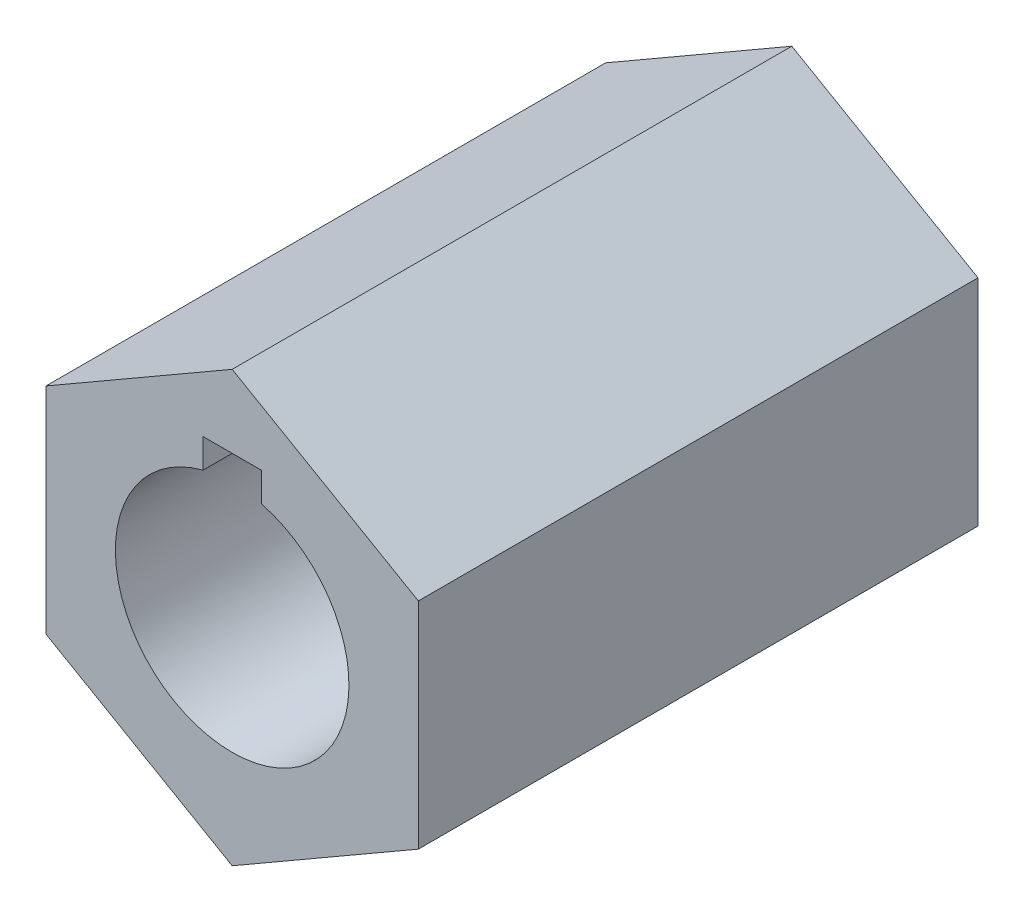
ISO-10303-21;
HEADER;
FILE_DESCRIPTION(('STEP AP214'),'2;1');
FILE_NAME('part.step','',(''),(''),'','','');
FILE_SCHEMA(('AUTOMOTIVE_DESIGN { 1 0 10303 214 1 1 1 1 }'));
ENDSEC;
DATA;
#1=APPLICATION_CONTEXT('core data for automotive mechanical design processes');
#2=APPLICATION_PROTOCOL_DEFINITION('international standard','automotive_design',2000,#1);
#3=PRODUCT_CONTEXT('',#1,'mechanical');
#4=PRODUCT('Part','Part','',(#3));
#5=PRODUCT_RELATED_PRODUCT_CATEGORY('part','',(#4));
#6=PRODUCT_DEFINITION_FORMATION('','',#4);
#7=PRODUCT_DEFINITION_CONTEXT('part definition',#1,'design');
#8=PRODUCT_DEFINITION('design','',#6,#7);
#9=PRODUCT_DEFINITION_SHAPE('','',#8);
#10=(LENGTH_UNIT() NAMED_UNIT(*) SI_UNIT(.MILLI.,.METRE.));
#11=(NAMED_UNIT(*) PLANE_ANGLE_UNIT() SI_UNIT($,.RADIAN.));
#12=(NAMED_UNIT(*) SI_UNIT($,.STERADIAN.) SOLID_ANGLE_UNIT());
#13=UNCERTAINTY_MEASURE_WITH_UNIT(LENGTH_MEASURE(1.E-05),#10,'distance_accuracy_value','');
#14=(GEOMETRIC_REPRESENTATION_CONTEXT(3) GLOBAL_UNCERTAINTY_ASSIGNED_CONTEXT((#13)) GLOBAL_UNIT_ASSIGNED_CONTEXT((#10,
#11,#12)) REPRESENTATION_CONTEXT('',''));
#15=CARTESIAN_POINT('',(0.,0.,0.));
#16=DIRECTION('',(0.,0.,1.));
#17=DIRECTION('',(1.,0.,0.));
#18=AXIS2_PLACEMENT_3D('',#15,#16,#17);
#19=CARTESIAN_POINT('',(6.33729999999998,0.,19.05));
#20=DIRECTION('',(-1.,0.,0.));
#21=DIRECTION('',(0.,-1.,0.));
#22=AXIS2_PLACEMENT_3D('',#19,#20,#21);
#23=PLANE('',#22);
#24=DIRECTION('',(0.,1.,0.));
#25=VECTOR('',#24,1.);
#26=CARTESIAN_POINT('',(6.33729999999998,0.,0.));
#27=LINE('',#26,#25);
#28=CARTESIAN_POINT('',(6.33729999999999,-3.65884186093543,0.));
#29=VERTEX_POINT('',#28);
#30=CARTESIAN_POINT('',(6.33729999999998,3.65884186093542,0.));
#31=VERTEX_POINT('',#30);
#32=EDGE_CURVE('E164',#29,#31,#27,.T.);
#33=ORIENTED_EDGE('',*,*,#32,.T.);
#34=DIRECTION('',(0.,0.,-1.));
#35=VECTOR('',#34,1.);
#36=CARTESIAN_POINT('',(6.33729999999998,3.65884186093542,19.05));
#37=LINE('',#36,#35);
#38=CARTESIAN_POINT('',(6.33729999999998,3.65884186093542,19.05));
#39=VERTEX_POINT('',#38);
#40=EDGE_CURVE('E11',#39,#31,#37,.T.);
#41=ORIENTED_EDGE('',*,*,#40,.F.);
#42=DIRECTION('',(0.,1.,0.));
#43=VECTOR('',#42,1.);
#44=CARTESIAN_POINT('',(6.33729999999998,0.,19.05));
#45=LINE('',#44,#43);
#46=CARTESIAN_POINT('',(6.33729999999999,-3.65884186093543,19.05));
#47=VERTEX_POINT('',#46);
#48=EDGE_CURVE('E245',#47,#39,#45,.T.);
#49=ORIENTED_EDGE('',*,*,#48,.F.);
#50=DIRECTION('',(0.,0.,-1.));
#51=VECTOR('',#50,1.);
#52=CARTESIAN_POINT('',(6.33729999999999,-3.65884186093543,19.05));
#53=LINE('',#52,#51);
#54=EDGE_CURVE('E175',#47,#29,#53,.T.);
#55=ORIENTED_EDGE('',*,*,#54,.T.);
#56=EDGE_LOOP('',(#33,#41,#49,#55));
#57=FACE_BOUND('',#56,.T.);
#58=ADVANCED_FACE('F39',(#57),#23,.F.);
#59=CARTESIAN_POINT('',(3.16865,5.48826279140312,19.05));
#60=DIRECTION('',(-0.5,-0.866025403784439,0.));
#61=DIRECTION('',(0.866025403784439,-0.5,0.));
#62=AXIS2_PLACEMENT_3D('',#59,#60,#61);
#63=PLANE('',#62);
#64=DIRECTION('',(-0.866025403784439,0.5,0.));
#65=VECTOR('',#64,1.);
#66=CARTESIAN_POINT('',(3.16865,5.48826279140312,0.));
#67=LINE('',#66,#65);
#68=CARTESIAN_POINT('',(0.,7.31768372187083,0.));
#69=VERTEX_POINT('',#68);
#70=EDGE_CURVE('E167',#31,#69,#67,.T.);
#71=ORIENTED_EDGE('',*,*,#70,.T.);
#72=DIRECTION('',(0.,0.,-1.));
#73=VECTOR('',#72,1.);
#74=CARTESIAN_POINT('',(0.,7.31768372187083,19.05));
#75=LINE('',#74,#73);
#76=CARTESIAN_POINT('',(0.,7.31768372187083,19.05));
#77=VERTEX_POINT('',#76);
#78=EDGE_CURVE('E49',#77,#69,#75,.T.);
#79=ORIENTED_EDGE('',*,*,#78,.F.);
#80=DIRECTION('',(-0.866025403784439,0.5,0.));
#81=VECTOR('',#80,1.);
#82=CARTESIAN_POINT('',(3.16865,5.48826279140312,19.05));
#83=LINE('',#82,#81);
#84=EDGE_CURVE('E247',#39,#77,#83,.T.);
#85=ORIENTED_EDGE('',*,*,#84,.F.);
#86=ORIENTED_EDGE('',*,*,#40,.T.);
#87=EDGE_LOOP('',(#71,#79,#85,#86));
#88=FACE_BOUND('',#87,.T.);
#89=ADVANCED_FACE('F214',(#88),#63,.F.);
#90=CARTESIAN_POINT('',(-3.16865,5.48826279140313,19.05));
#91=DIRECTION('',(0.5,-0.866025403784439,0.));
#92=DIRECTION('',(0.866025403784439,0.5,0.));
#93=AXIS2_PLACEMENT_3D('',#90,#91,#92);
#94=PLANE('',#93);
#95=DIRECTION('',(-0.866025403784439,-0.5,0.));
#96=VECTOR('',#95,1.);
#97=CARTESIAN_POINT('',(-3.16865,5.48826279140313,0.));
#98=LINE('',#97,#96);
#99=CARTESIAN_POINT('',(-6.3373,3.65884186093542,0.));
#100=VERTEX_POINT('',#99);
#101=EDGE_CURVE('E169',#69,#100,#98,.T.);
#102=ORIENTED_EDGE('',*,*,#101,.T.);
#103=DIRECTION('',(0.,0.,-1.));
#104=VECTOR('',#103,1.);
#105=CARTESIAN_POINT('',(-6.3373,3.65884186093542,19.05));
#106=LINE('',#105,#104);
#107=CARTESIAN_POINT('',(-6.3373,3.65884186093542,19.05));
#108=VERTEX_POINT('',#107);
#109=EDGE_CURVE('E142',#108,#100,#106,.T.);
#110=ORIENTED_EDGE('',*,*,#109,.F.);
#111=DIRECTION('',(-0.866025403784439,-0.5,0.));
#112=VECTOR('',#111,1.);
#113=CARTESIAN_POINT('',(-3.16865,5.48826279140313,19.05));
#114=LINE('',#113,#112);
#115=EDGE_CURVE('E133',#77,#108,#114,.T.);
#116=ORIENTED_EDGE('',*,*,#115,.F.);
#117=ORIENTED_EDGE('',*,*,#78,.T.);
#118=EDGE_LOOP('',(#102,#110,#116,#117));
#119=FACE_BOUND('',#118,.T.);
#120=ADVANCED_FACE('F220',(#119),#94,.F.);
#121=CARTESIAN_POINT('',(-6.3373,0.,19.05));
#122=DIRECTION('',(1.,0.,0.));
#123=DIRECTION('',(0.,0.,-1.));
#124=AXIS2_PLACEMENT_3D('',#121,#122,#123);
#125=PLANE('',#124);
#126=DIRECTION('',(0.,-1.,0.));
#127=VECTOR('',#126,1.);
#128=CARTESIAN_POINT('',(-6.3373,0.,0.));
#129=LINE('',#128,#127);
#130=CARTESIAN_POINT('',(-6.3373,-3.65884186093541,0.));
#131=VERTEX_POINT('',#130);
#132=EDGE_CURVE('E141',#100,#131,#129,.T.);
#133=ORIENTED_EDGE('',*,*,#132,.T.);
#134=DIRECTION('',(0.,0.,-1.));
#135=VECTOR('',#134,1.);
#136=CARTESIAN_POINT('',(-6.3373,-3.65884186093541,19.05));
#137=LINE('',#136,#135);
#138=CARTESIAN_POINT('',(-6.3373,-3.65884186093541,19.05));
#139=VERTEX_POINT('',#138);
#140=EDGE_CURVE('E138',#139,#131,#137,.T.);
#141=ORIENTED_EDGE('',*,*,#140,.F.);
#142=DIRECTION('',(0.,-1.,0.));
#143=VECTOR('',#142,1.);
#144=CARTESIAN_POINT('',(-6.3373,0.,19.05));
#145=LINE('',#144,#143);
#146=EDGE_CURVE('E127',#108,#139,#145,.T.);
#147=ORIENTED_EDGE('',*,*,#146,.F.);
#148=ORIENTED_EDGE('',*,*,#109,.T.);
#149=EDGE_LOOP('',(#133,#141,#147,#148));
#150=FACE_BOUND('',#149,.T.);
#151=ADVANCED_FACE('F139',(#150),#125,.F.);
#152=CARTESIAN_POINT('',(-3.16865,-5.48826279140312,19.05));
#153=DIRECTION('',(0.499999999999999,0.866025403784439,0.));
#154=DIRECTION('',(-0.866025403784439,0.5,0.));
#155=AXIS2_PLACEMENT_3D('',#152,#153,#154);
#156=PLANE('',#155);
#157=DIRECTION('',(0.866025403784439,-0.5,0.));
#158=VECTOR('',#157,1.);
#159=CARTESIAN_POINT('',(-3.16865,-5.48826279140312,0.));
#160=LINE('',#159,#158);
#161=CARTESIAN_POINT('',(0.,-7.31768372187083,0.));
#162=VERTEX_POINT('',#161);
#163=EDGE_CURVE('E93',#131,#162,#160,.T.);
#164=ORIENTED_EDGE('',*,*,#163,.T.);
#165=DIRECTION('',(0.,0.,-1.));
#166=VECTOR('',#165,1.);
#167=CARTESIAN_POINT('',(0.,-7.31768372187083,19.05));
#168=LINE('',#167,#166);
#169=CARTESIAN_POINT('',(0.,-7.31768372187083,19.05));
#170=VERTEX_POINT('',#169);
#171=EDGE_CURVE('E143',#170,#162,#168,.T.);
#172=ORIENTED_EDGE('',*,*,#171,.F.);
#173=DIRECTION('',(0.866025403784439,-0.5,0.));
#174=VECTOR('',#173,1.);
#175=CARTESIAN_POINT('',(-3.16865,-5.48826279140312,19.05));
#176=LINE('',#175,#174);
#177=EDGE_CURVE('E131',#139,#170,#176,.T.);
#178=ORIENTED_EDGE('',*,*,#177,.F.);
#179=ORIENTED_EDGE('',*,*,#140,.T.);
#180=EDGE_LOOP('',(#164,#172,#178,#179));
#181=FACE_BOUND('',#180,.T.);
#182=ADVANCED_FACE('F145',(#181),#156,.F.);
#183=CARTESIAN_POINT('',(0.,0.,19.05));
#184=DIRECTION('',(0.,0.,-1.));
#185=DIRECTION('',(-1.,0.,0.));
#186=AXIS2_PLACEMENT_3D('',#183,#184,#185);
#187=CYLINDRICAL_SURFACE('',#186,3.9751);
#188=CARTESIAN_POINT('',(0.,0.,0.));
#189=DIRECTION('',(0.,0.,1.));
#190=DIRECTION('',(1.,0.,0.));
#191=AXIS2_PLACEMENT_3D('',#188,#189,#190);
#192=CIRCLE('',#191,3.9751);
#193=CARTESIAN_POINT('',(-0.9906,3.84969240979068,0.));
#194=VERTEX_POINT('',#193);
#195=CARTESIAN_POINT('',(0.9906,3.84969240979068,0.));
#196=VERTEX_POINT('',#195);
#197=EDGE_CURVE('E151',#194,#196,#192,.T.);
#198=ORIENTED_EDGE('',*,*,#197,.F.);
#199=DIRECTION('',(0.,0.,-1.));
#200=VECTOR('',#199,1.);
#201=CARTESIAN_POINT('',(-0.9906,3.84969240979068,19.05));
#202=LINE('',#201,#200);
#203=CARTESIAN_POINT('',(-0.9906,3.84969240979068,19.05));
#204=VERTEX_POINT('',#203);
#205=EDGE_CURVE('E43',#204,#194,#202,.T.);
#206=ORIENTED_EDGE('',*,*,#205,.F.);
#207=CARTESIAN_POINT('',(0.,0.,19.05));
#208=DIRECTION('',(0.,0.,1.));
#209=DIRECTION('',(1.,0.,0.));
#210=AXIS2_PLACEMENT_3D('',#207,#208,#209);
#211=CIRCLE('',#210,3.9751);
#212=CARTESIAN_POINT('',(0.9906,3.84969240979068,19.05));
#213=VERTEX_POINT('',#212);
#214=EDGE_CURVE('E174',#204,#213,#211,.T.);
#215=ORIENTED_EDGE('',*,*,#214,.T.);
#216=DIRECTION('',(0.,0.,-1.));
#217=VECTOR('',#216,1.);
#218=CARTESIAN_POINT('',(0.9906,3.84969240979068,19.05));
#219=LINE('',#218,#217);
#220=EDGE_CURVE('E147',#213,#196,#219,.T.);
#221=ORIENTED_EDGE('',*,*,#220,.T.);
#222=EDGE_LOOP('',(#198,#206,#215,#221));
#223=FACE_BOUND('',#222,.T.);
#224=ADVANCED_FACE('F41',(#223),#187,.F.);
#225=CARTESIAN_POINT('',(-0.9906,0.,19.05));
#226=DIRECTION('',(-1.,0.,0.));
#227=DIRECTION('',(0.,0.,1.));
#228=AXIS2_PLACEMENT_3D('',#225,#226,#227);
#229=PLANE('',#228);
#230=DIRECTION('',(0.,1.,0.));
#231=VECTOR('',#230,1.);
#232=CARTESIAN_POINT('',(-0.9906,0.,0.));
#233=LINE('',#232,#231);
#234=CARTESIAN_POINT('',(-0.9906,4.84029240979068,0.));
#235=VERTEX_POINT('',#234);
#236=EDGE_CURVE('E155',#194,#235,#233,.T.);
#237=ORIENTED_EDGE('',*,*,#236,.T.);
#238=DIRECTION('',(0.,0.,-1.));
#239=VECTOR('',#238,1.);
#240=CARTESIAN_POINT('',(-0.9906,4.84029240979068,19.05));
#241=LINE('',#240,#239);
#242=CARTESIAN_POINT('',(-0.9906,4.84029240979068,19.05));
#243=VERTEX_POINT('',#242);
#244=EDGE_CURVE('E183',#243,#235,#241,.T.);
#245=ORIENTED_EDGE('',*,*,#244,.F.);
#246=DIRECTION('',(0.,1.,0.));
#247=VECTOR('',#246,1.);
#248=CARTESIAN_POINT('',(-0.9906,0.,19.05));
#249=LINE('',#248,#247);
#250=EDGE_CURVE('E192',#204,#243,#249,.T.);
#251=ORIENTED_EDGE('',*,*,#250,.F.);
#252=ORIENTED_EDGE('',*,*,#205,.T.);
#253=EDGE_LOOP('',(#237,#245,#251,#252));
#254=FACE_BOUND('',#253,.T.);
#255=ADVANCED_FACE('F191',(#254),#229,.F.);
#256=CARTESIAN_POINT('',(0.,4.84029240979068,19.05));
#257=DIRECTION('',(0.,1.,0.));
#258=DIRECTION('',(-1.,0.,0.));
#259=AXIS2_PLACEMENT_3D('',#256,#257,#258);
#260=PLANE('',#259);
#261=DIRECTION('',(1.,0.,0.));
#262=VECTOR('',#261,1.);
#263=CARTESIAN_POINT('',(0.,4.84029240979068,0.));
#264=LINE('',#263,#262);
#265=CARTESIAN_POINT('',(0.9906,4.84029240979068,0.));
#266=VERTEX_POINT('',#265);
#267=EDGE_CURVE('E158',#235,#266,#264,.T.);
#268=ORIENTED_EDGE('',*,*,#267,.T.);
#269=DIRECTION('',(0.,0.,-1.));
#270=VECTOR('',#269,1.);
#271=CARTESIAN_POINT('',(0.9906,4.84029240979068,19.05));
#272=LINE('',#271,#270);
#273=CARTESIAN_POINT('',(0.9906,4.84029240979068,19.05));
#274=VERTEX_POINT('',#273);
#275=EDGE_CURVE('E182',#274,#266,#272,.T.);
#276=ORIENTED_EDGE('',*,*,#275,.F.);
#277=DIRECTION('',(1.,0.,0.));
#278=VECTOR('',#277,1.);
#279=CARTESIAN_POINT('',(0.,4.84029240979068,19.05));
#280=LINE('',#279,#278);
#281=EDGE_CURVE('E240',#243,#274,#280,.T.);
#282=ORIENTED_EDGE('',*,*,#281,.F.);
#283=ORIENTED_EDGE('',*,*,#244,.T.);
#284=EDGE_LOOP('',(#268,#276,#282,#283));
#285=FACE_BOUND('',#284,.T.);
#286=ADVANCED_FACE('F204',(#285),#260,.F.);
#287=CARTESIAN_POINT('',(0.9906,0.,19.05));
#288=DIRECTION('',(-1.,0.,0.));
#289=DIRECTION('',(0.,0.,1.));
#290=AXIS2_PLACEMENT_3D('',#287,#288,#289);
#291=PLANE('',#290);
#292=DIRECTION('',(0.,1.,0.));
#293=VECTOR('',#292,1.);
#294=CARTESIAN_POINT('',(0.9906,0.,0.));
#295=LINE('',#294,#293);
#296=EDGE_CURVE('E161',#196,#266,#295,.T.);
#297=ORIENTED_EDGE('',*,*,#296,.F.);
#298=ORIENTED_EDGE('',*,*,#220,.F.);
#299=DIRECTION('',(0.,1.,0.));
#300=VECTOR('',#299,1.);
#301=CARTESIAN_POINT('',(0.9906,0.,19.05));
#302=LINE('',#301,#300);
#303=EDGE_CURVE('E202',#213,#274,#302,.T.);
#304=ORIENTED_EDGE('',*,*,#303,.T.);
#305=ORIENTED_EDGE('',*,*,#275,.T.);
#306=EDGE_LOOP('',(#297,#298,#304,#305));
#307=FACE_BOUND('',#306,.T.);
#308=ADVANCED_FACE('F201',(#307),#291,.T.);
#309=CARTESIAN_POINT('',(3.16865,-5.48826279140313,19.05));
#310=DIRECTION('',(-0.5,0.866025403784439,0.));
#311=DIRECTION('',(-0.866025403784439,-0.5,0.));
#312=AXIS2_PLACEMENT_3D('',#309,#310,#311);
#313=PLANE('',#312);
#314=DIRECTION('',(0.866025403784439,0.5,0.));
#315=VECTOR('',#314,1.);
#316=CARTESIAN_POINT('',(3.16865,-5.48826279140313,0.));
#317=LINE('',#316,#315);
#318=EDGE_CURVE('E99',#162,#29,#317,.T.);
#319=ORIENTED_EDGE('',*,*,#318,.T.);
#320=ORIENTED_EDGE('',*,*,#54,.F.);
#321=DIRECTION('',(0.866025403784439,0.5,0.));
#322=VECTOR('',#321,1.);
#323=CARTESIAN_POINT('',(3.16865,-5.48826279140313,19.05));
#324=LINE('',#323,#322);
#325=EDGE_CURVE('E58',#170,#47,#324,.T.);
#326=ORIENTED_EDGE('',*,*,#325,.F.);
#327=ORIENTED_EDGE('',*,*,#171,.T.);
#328=EDGE_LOOP('',(#319,#320,#326,#327));
#329=FACE_BOUND('',#328,.T.);
#330=ADVANCED_FACE('F211',(#329),#313,.F.);
#331=CARTESIAN_POINT('',(0.,0.,19.05));
#332=DIRECTION('',(0.,0.,1.));
#333=DIRECTION('',(1.,0.,0.));
#334=AXIS2_PLACEMENT_3D('',#331,#332,#333);
#335=PLANE('',#334);
#336=ORIENTED_EDGE('',*,*,#214,.F.);
#337=ORIENTED_EDGE('',*,*,#250,.T.);
#338=ORIENTED_EDGE('',*,*,#281,.T.);
#339=ORIENTED_EDGE('',*,*,#303,.F.);
#340=EDGE_LOOP('',(#336,#337,#338,#339));
#341=FACE_BOUND('',#340,.T.);
#342=ORIENTED_EDGE('',*,*,#48,.T.);
#343=ORIENTED_EDGE('',*,*,#84,.T.);
#344=ORIENTED_EDGE('',*,*,#115,.T.);
#345=ORIENTED_EDGE('',*,*,#146,.T.);
#346=ORIENTED_EDGE('',*,*,#177,.T.);
#347=ORIENTED_EDGE('',*,*,#325,.T.);
#348=EDGE_LOOP('',(#342,#343,#344,#345,#346,#347));
#349=FACE_BOUND('',#348,.T.);
#350=ADVANCED_FACE('F129',(#341,#349),#335,.T.);
#351=CARTESIAN_POINT('',(0.,0.,0.));
#352=DIRECTION('',(0.,0.,1.));
#353=DIRECTION('',(1.,0.,0.));
#354=AXIS2_PLACEMENT_3D('',#351,#352,#353);
#355=PLANE('',#354);
#356=ORIENTED_EDGE('',*,*,#197,.T.);
#357=ORIENTED_EDGE('',*,*,#296,.T.);
#358=ORIENTED_EDGE('',*,*,#267,.F.);
#359=ORIENTED_EDGE('',*,*,#236,.F.);
#360=EDGE_LOOP('',(#356,#357,#358,#359));
#361=FACE_BOUND('',#360,.T.);
#362=ORIENTED_EDGE('',*,*,#32,.F.);
#363=ORIENTED_EDGE('',*,*,#318,.F.);
#364=ORIENTED_EDGE('',*,*,#163,.F.);
#365=ORIENTED_EDGE('',*,*,#132,.F.);
#366=ORIENTED_EDGE('',*,*,#101,.F.);
#367=ORIENTED_EDGE('',*,*,#70,.F.);
#368=EDGE_LOOP('',(#362,#363,#364,#365,#366,#367));
#369=FACE_BOUND('',#368,.T.);
#370=ADVANCED_FACE('F195',(#361,#369),#355,.F.);
#371=CLOSED_SHELL('',(#58,#89,#120,#151,#182,#224,#255,#286,#308,#330,#350,#370));
#372=MANIFOLD_SOLID_BREP('B2',#371);
#373=ADVANCED_BREP_SHAPE_REPRESENTATION('',(#18,#372),#14);
#374=SHAPE_DEFINITION_REPRESENTATION(#9,#373);
ENDSEC;
END-ISO-10303-21;
